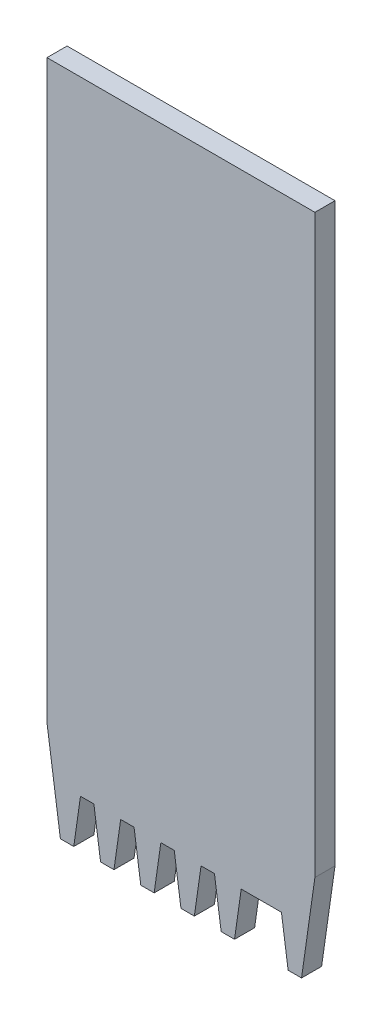
ISO-10303-21;
HEADER;
FILE_DESCRIPTION(('STEP AP214'),'2;1');
FILE_NAME('part.step','',(''),(''),'','','');
FILE_SCHEMA(('AUTOMOTIVE_DESIGN { 1 0 10303 214 1 1 1 1 }'));
ENDSEC;
DATA;
#1=APPLICATION_CONTEXT('core data for automotive mechanical design processes');
#2=APPLICATION_PROTOCOL_DEFINITION('international standard','automotive_design',2000,#1);
#3=PRODUCT_CONTEXT('',#1,'mechanical');
#4=PRODUCT('Part','Part','',(#3));
#5=PRODUCT_RELATED_PRODUCT_CATEGORY('part','',(#4));
#6=PRODUCT_DEFINITION_FORMATION('','',#4);
#7=PRODUCT_DEFINITION_CONTEXT('part definition',#1,'design');
#8=PRODUCT_DEFINITION('design','',#6,#7);
#9=PRODUCT_DEFINITION_SHAPE('','',#8);
#10=(LENGTH_UNIT() NAMED_UNIT(*) SI_UNIT(.MILLI.,.METRE.));
#11=(NAMED_UNIT(*) PLANE_ANGLE_UNIT() SI_UNIT($,.RADIAN.));
#12=(NAMED_UNIT(*) SI_UNIT($,.STERADIAN.) SOLID_ANGLE_UNIT());
#13=UNCERTAINTY_MEASURE_WITH_UNIT(LENGTH_MEASURE(1.E-05),#10,'distance_accuracy_value','');
#14=(GEOMETRIC_REPRESENTATION_CONTEXT(3) GLOBAL_UNCERTAINTY_ASSIGNED_CONTEXT((#13)) GLOBAL_UNIT_ASSIGNED_CONTEXT((#10,
#11,#12)) REPRESENTATION_CONTEXT('',''));
#15=CARTESIAN_POINT('',(0.,0.,0.));
#16=DIRECTION('',(0.,0.,1.));
#17=DIRECTION('',(1.,0.,0.));
#18=AXIS2_PLACEMENT_3D('',#15,#16,#17);
#19=CARTESIAN_POINT('',(0.,50.,1.5));
#20=DIRECTION('',(0.,-1.,0.));
#21=DIRECTION('',(0.,0.,-1.));
#22=AXIS2_PLACEMENT_3D('',#19,#20,#21);
#23=PLANE('',#22);
#24=DIRECTION('',(-1.,0.,0.));
#25=VECTOR('',#24,1.);
#26=CARTESIAN_POINT('',(0.,50.,0.));
#27=LINE('',#26,#25);
#28=CARTESIAN_POINT('',(20.,50.,0.));
#29=VERTEX_POINT('',#28);
#30=CARTESIAN_POINT('',(0.,50.,0.));
#31=VERTEX_POINT('',#30);
#32=EDGE_CURVE('E239',#29,#31,#27,.T.);
#33=ORIENTED_EDGE('',*,*,#32,.T.);
#34=DIRECTION('',(0.,0.,-1.));
#35=VECTOR('',#34,1.);
#36=CARTESIAN_POINT('',(0.,50.,1.5));
#37=LINE('',#36,#35);
#38=CARTESIAN_POINT('',(0.,50.,1.5));
#39=VERTEX_POINT('',#38);
#40=EDGE_CURVE('E11',#39,#31,#37,.T.);
#41=ORIENTED_EDGE('',*,*,#40,.F.);
#42=DIRECTION('',(-1.,0.,0.));
#43=VECTOR('',#42,1.);
#44=CARTESIAN_POINT('',(0.,50.,1.5));
#45=LINE('',#44,#43);
#46=CARTESIAN_POINT('',(20.,50.,1.5));
#47=VERTEX_POINT('',#46);
#48=EDGE_CURVE('E289',#47,#39,#45,.T.);
#49=ORIENTED_EDGE('',*,*,#48,.F.);
#50=DIRECTION('',(0.,0.,-1.));
#51=VECTOR('',#50,1.);
#52=CARTESIAN_POINT('',(20.,50.,1.5));
#53=LINE('',#52,#51);
#54=EDGE_CURVE('E235',#47,#29,#53,.T.);
#55=ORIENTED_EDGE('',*,*,#54,.T.);
#56=EDGE_LOOP('',(#33,#41,#49,#55));
#57=FACE_BOUND('',#56,.T.);
#58=ADVANCED_FACE('F35',(#57),#23,.F.);
#59=CARTESIAN_POINT('',(0.,7.,1.5));
#60=DIRECTION('',(1.,0.,0.));
#61=DIRECTION('',(0.,0.,-1.));
#62=AXIS2_PLACEMENT_3D('',#59,#60,#61);
#63=PLANE('',#62);
#64=DIRECTION('',(0.,-1.,0.));
#65=VECTOR('',#64,1.);
#66=CARTESIAN_POINT('',(0.,7.,0.));
#67=LINE('',#66,#65);
#68=CARTESIAN_POINT('',(0.,7.,0.));
#69=VERTEX_POINT('',#68);
#70=EDGE_CURVE('E242',#31,#69,#67,.T.);
#71=ORIENTED_EDGE('',*,*,#70,.T.);
#72=DIRECTION('',(0.,0.,-1.));
#73=VECTOR('',#72,1.);
#74=CARTESIAN_POINT('',(0.,7.,1.5));
#75=LINE('',#74,#73);
#76=CARTESIAN_POINT('',(0.,7.,1.5));
#77=VERTEX_POINT('',#76);
#78=EDGE_CURVE('E43',#77,#69,#75,.T.);
#79=ORIENTED_EDGE('',*,*,#78,.F.);
#80=DIRECTION('',(0.,-1.,0.));
#81=VECTOR('',#80,1.);
#82=CARTESIAN_POINT('',(0.,7.,1.5));
#83=LINE('',#82,#81);
#84=EDGE_CURVE('E148',#39,#77,#83,.T.);
#85=ORIENTED_EDGE('',*,*,#84,.F.);
#86=ORIENTED_EDGE('',*,*,#40,.T.);
#87=EDGE_LOOP('',(#71,#79,#85,#86));
#88=FACE_BOUND('',#87,.T.);
#89=ADVANCED_FACE('F437',(#88),#63,.F.);
#90=CARTESIAN_POINT('',(0.,7.,1.5));
#91=DIRECTION('',(0.989949493661167,0.14142135623731,0.));
#92=DIRECTION('',(-0.14142135623731,0.989949493661167,0.));
#93=AXIS2_PLACEMENT_3D('',#90,#91,#92);
#94=PLANE('',#93);
#95=DIRECTION('',(0.14142135623731,-0.989949493661167,0.));
#96=VECTOR('',#95,1.);
#97=CARTESIAN_POINT('',(0.,7.,0.));
#98=LINE('',#97,#96);
#99=CARTESIAN_POINT('',(1.,0.,0.));
#100=VERTEX_POINT('',#99);
#101=EDGE_CURVE('E244',#69,#100,#98,.T.);
#102=ORIENTED_EDGE('',*,*,#101,.T.);
#103=DIRECTION('',(0.,0.,-1.));
#104=VECTOR('',#103,1.);
#105=CARTESIAN_POINT('',(1.,0.,1.5));
#106=LINE('',#105,#104);
#107=CARTESIAN_POINT('',(1.,0.,1.5));
#108=VERTEX_POINT('',#107);
#109=EDGE_CURVE('E350',#108,#100,#106,.T.);
#110=ORIENTED_EDGE('',*,*,#109,.F.);
#111=DIRECTION('',(0.14142135623731,-0.989949493661167,0.));
#112=VECTOR('',#111,1.);
#113=CARTESIAN_POINT('',(0.,7.,1.5));
#114=LINE('',#113,#112);
#115=EDGE_CURVE('E358',#77,#108,#114,.T.);
#116=ORIENTED_EDGE('',*,*,#115,.F.);
#117=ORIENTED_EDGE('',*,*,#78,.T.);
#118=EDGE_LOOP('',(#102,#110,#116,#117));
#119=FACE_BOUND('',#118,.T.);
#120=ADVANCED_FACE('F356',(#119),#94,.F.);
#121=CARTESIAN_POINT('',(1.,0.,1.5));
#122=DIRECTION('',(0.,1.,0.));
#123=DIRECTION('',(-1.,0.,0.));
#124=AXIS2_PLACEMENT_3D('',#121,#122,#123);
#125=PLANE('',#124);
#126=DIRECTION('',(1.,0.,0.));
#127=VECTOR('',#126,1.);
#128=CARTESIAN_POINT('',(1.,0.,0.));
#129=LINE('',#128,#127);
#130=CARTESIAN_POINT('',(2.,0.,0.));
#131=VERTEX_POINT('',#130);
#132=EDGE_CURVE('E246',#100,#131,#129,.T.);
#133=ORIENTED_EDGE('',*,*,#132,.T.);
#134=DIRECTION('',(0.,0.,-1.));
#135=VECTOR('',#134,1.);
#136=CARTESIAN_POINT('',(2.,0.,1.5));
#137=LINE('',#136,#135);
#138=CARTESIAN_POINT('',(2.,0.,1.5));
#139=VERTEX_POINT('',#138);
#140=EDGE_CURVE('E347',#139,#131,#137,.T.);
#141=ORIENTED_EDGE('',*,*,#140,.F.);
#142=DIRECTION('',(1.,0.,0.));
#143=VECTOR('',#142,1.);
#144=CARTESIAN_POINT('',(1.,0.,1.5));
#145=LINE('',#144,#143);
#146=EDGE_CURVE('E376',#108,#139,#145,.T.);
#147=ORIENTED_EDGE('',*,*,#146,.F.);
#148=ORIENTED_EDGE('',*,*,#109,.T.);
#149=EDGE_LOOP('',(#133,#141,#147,#148));
#150=FACE_BOUND('',#149,.T.);
#151=ADVANCED_FACE('F367',(#150),#125,.F.);
#152=CARTESIAN_POINT('',(2.,0.,1.5));
#153=DIRECTION('',(-0.989949493661166,0.14142135623731,0.));
#154=DIRECTION('',(-0.14142135623731,-0.989949493661167,0.));
#155=AXIS2_PLACEMENT_3D('',#152,#153,#154);
#156=PLANE('',#155);
#157=DIRECTION('',(0.14142135623731,0.989949493661167,0.));
#158=VECTOR('',#157,1.);
#159=CARTESIAN_POINT('',(2.,0.,0.));
#160=LINE('',#159,#158);
#161=CARTESIAN_POINT('',(2.5,3.5,0.));
#162=VERTEX_POINT('',#161);
#163=EDGE_CURVE('E248',#131,#162,#160,.T.);
#164=ORIENTED_EDGE('',*,*,#163,.T.);
#165=DIRECTION('',(0.,0.,-1.));
#166=VECTOR('',#165,1.);
#167=CARTESIAN_POINT('',(2.5,3.5,1.5));
#168=LINE('',#167,#166);
#169=CARTESIAN_POINT('',(2.5,3.5,1.5));
#170=VERTEX_POINT('',#169);
#171=EDGE_CURVE('E344',#170,#162,#168,.T.);
#172=ORIENTED_EDGE('',*,*,#171,.F.);
#173=DIRECTION('',(0.14142135623731,0.989949493661167,0.));
#174=VECTOR('',#173,1.);
#175=CARTESIAN_POINT('',(2.,0.,1.5));
#176=LINE('',#175,#174);
#177=EDGE_CURVE('E373',#139,#170,#176,.T.);
#178=ORIENTED_EDGE('',*,*,#177,.F.);
#179=ORIENTED_EDGE('',*,*,#140,.T.);
#180=EDGE_LOOP('',(#164,#172,#178,#179));
#181=FACE_BOUND('',#180,.T.);
#182=ADVANCED_FACE('F371',(#181),#156,.F.);
#183=CARTESIAN_POINT('',(2.5,3.5,1.5));
#184=DIRECTION('',(0.,1.,0.));
#185=DIRECTION('',(0.,0.,1.));
#186=AXIS2_PLACEMENT_3D('',#183,#184,#185);
#187=PLANE('',#186);
#188=DIRECTION('',(1.,0.,0.));
#189=VECTOR('',#188,1.);
#190=CARTESIAN_POINT('',(2.5,3.5,0.));
#191=LINE('',#190,#189);
#192=CARTESIAN_POINT('',(3.5,3.5,0.));
#193=VERTEX_POINT('',#192);
#194=EDGE_CURVE('E250',#162,#193,#191,.T.);
#195=ORIENTED_EDGE('',*,*,#194,.T.);
#196=DIRECTION('',(0.,0.,-1.));
#197=VECTOR('',#196,1.);
#198=CARTESIAN_POINT('',(3.5,3.5,1.5));
#199=LINE('',#198,#197);
#200=CARTESIAN_POINT('',(3.5,3.5,1.5));
#201=VERTEX_POINT('',#200);
#202=EDGE_CURVE('E341',#201,#193,#199,.T.);
#203=ORIENTED_EDGE('',*,*,#202,.F.);
#204=DIRECTION('',(1.,0.,0.));
#205=VECTOR('',#204,1.);
#206=CARTESIAN_POINT('',(2.5,3.5,1.5));
#207=LINE('',#206,#205);
#208=EDGE_CURVE('E375',#170,#201,#207,.T.);
#209=ORIENTED_EDGE('',*,*,#208,.F.);
#210=ORIENTED_EDGE('',*,*,#171,.T.);
#211=EDGE_LOOP('',(#195,#203,#209,#210));
#212=FACE_BOUND('',#211,.T.);
#213=ADVANCED_FACE('F450',(#212),#187,.F.);
#214=CARTESIAN_POINT('',(3.5,3.5,1.5));
#215=DIRECTION('',(0.989949493661167,0.14142135623731,0.));
#216=DIRECTION('',(-0.14142135623731,0.989949493661167,0.));
#217=AXIS2_PLACEMENT_3D('',#214,#215,#216);
#218=PLANE('',#217);
#219=DIRECTION('',(0.14142135623731,-0.989949493661167,0.));
#220=VECTOR('',#219,1.);
#221=CARTESIAN_POINT('',(3.5,3.5,0.));
#222=LINE('',#221,#220);
#223=CARTESIAN_POINT('',(4.,0.,0.));
#224=VERTEX_POINT('',#223);
#225=EDGE_CURVE('E252',#193,#224,#222,.T.);
#226=ORIENTED_EDGE('',*,*,#225,.T.);
#227=DIRECTION('',(0.,0.,-1.));
#228=VECTOR('',#227,1.);
#229=CARTESIAN_POINT('',(4.,0.,1.5));
#230=LINE('',#229,#228);
#231=CARTESIAN_POINT('',(4.,0.,1.5));
#232=VERTEX_POINT('',#231);
#233=EDGE_CURVE('E338',#232,#224,#230,.T.);
#234=ORIENTED_EDGE('',*,*,#233,.F.);
#235=DIRECTION('',(0.14142135623731,-0.989949493661167,0.));
#236=VECTOR('',#235,1.);
#237=CARTESIAN_POINT('',(3.5,3.5,1.5));
#238=LINE('',#237,#236);
#239=EDGE_CURVE('E378',#201,#232,#238,.T.);
#240=ORIENTED_EDGE('',*,*,#239,.F.);
#241=ORIENTED_EDGE('',*,*,#202,.T.);
#242=EDGE_LOOP('',(#226,#234,#240,#241));
#243=FACE_BOUND('',#242,.T.);
#244=ADVANCED_FACE('F453',(#243),#218,.F.);
#245=CARTESIAN_POINT('',(4.,0.,1.5));
#246=DIRECTION('',(0.,1.,0.));
#247=DIRECTION('',(-1.,0.,0.));
#248=AXIS2_PLACEMENT_3D('',#245,#246,#247);
#249=PLANE('',#248);
#250=DIRECTION('',(1.,0.,0.));
#251=VECTOR('',#250,1.);
#252=CARTESIAN_POINT('',(4.,0.,0.));
#253=LINE('',#252,#251);
#254=CARTESIAN_POINT('',(5.,0.,0.));
#255=VERTEX_POINT('',#254);
#256=EDGE_CURVE('E254',#224,#255,#253,.T.);
#257=ORIENTED_EDGE('',*,*,#256,.T.);
#258=DIRECTION('',(0.,0.,-1.));
#259=VECTOR('',#258,1.);
#260=CARTESIAN_POINT('',(5.,0.,1.5));
#261=LINE('',#260,#259);
#262=CARTESIAN_POINT('',(5.,0.,1.5));
#263=VERTEX_POINT('',#262);
#264=EDGE_CURVE('E335',#263,#255,#261,.T.);
#265=ORIENTED_EDGE('',*,*,#264,.F.);
#266=DIRECTION('',(1.,0.,0.));
#267=VECTOR('',#266,1.);
#268=CARTESIAN_POINT('',(4.,0.,1.5));
#269=LINE('',#268,#267);
#270=EDGE_CURVE('E384',#232,#263,#269,.T.);
#271=ORIENTED_EDGE('',*,*,#270,.F.);
#272=ORIENTED_EDGE('',*,*,#233,.T.);
#273=EDGE_LOOP('',(#257,#265,#271,#272));
#274=FACE_BOUND('',#273,.T.);
#275=ADVANCED_FACE('F457',(#274),#249,.F.);
#276=CARTESIAN_POINT('',(5.,0.,1.5));
#277=DIRECTION('',(-0.989949493661167,0.14142135623731,0.));
#278=DIRECTION('',(-0.14142135623731,-0.989949493661167,0.));
#279=AXIS2_PLACEMENT_3D('',#276,#277,#278);
#280=PLANE('',#279);
#281=DIRECTION('',(0.14142135623731,0.989949493661166,0.));
#282=VECTOR('',#281,1.);
#283=CARTESIAN_POINT('',(5.,0.,0.));
#284=LINE('',#283,#282);
#285=CARTESIAN_POINT('',(5.5,3.5,0.));
#286=VERTEX_POINT('',#285);
#287=EDGE_CURVE('E256',#255,#286,#284,.T.);
#288=ORIENTED_EDGE('',*,*,#287,.T.);
#289=DIRECTION('',(0.,0.,-1.));
#290=VECTOR('',#289,1.);
#291=CARTESIAN_POINT('',(5.5,3.5,1.5));
#292=LINE('',#291,#290);
#293=CARTESIAN_POINT('',(5.5,3.5,1.5));
#294=VERTEX_POINT('',#293);
#295=EDGE_CURVE('E332',#294,#286,#292,.T.);
#296=ORIENTED_EDGE('',*,*,#295,.F.);
#297=DIRECTION('',(0.14142135623731,0.989949493661166,0.));
#298=VECTOR('',#297,1.);
#299=CARTESIAN_POINT('',(5.,0.,1.5));
#300=LINE('',#299,#298);
#301=EDGE_CURVE('E386',#263,#294,#300,.T.);
#302=ORIENTED_EDGE('',*,*,#301,.F.);
#303=ORIENTED_EDGE('',*,*,#264,.T.);
#304=EDGE_LOOP('',(#288,#296,#302,#303));
#305=FACE_BOUND('',#304,.T.);
#306=ADVANCED_FACE('F461',(#305),#280,.F.);
#307=CARTESIAN_POINT('',(5.5,3.5,1.5));
#308=DIRECTION('',(0.,1.,0.));
#309=DIRECTION('',(0.,0.,1.));
#310=AXIS2_PLACEMENT_3D('',#307,#308,#309);
#311=PLANE('',#310);
#312=DIRECTION('',(1.,0.,0.));
#313=VECTOR('',#312,1.);
#314=CARTESIAN_POINT('',(5.5,3.5,0.));
#315=LINE('',#314,#313);
#316=CARTESIAN_POINT('',(6.5,3.5,0.));
#317=VERTEX_POINT('',#316);
#318=EDGE_CURVE('E258',#286,#317,#315,.T.);
#319=ORIENTED_EDGE('',*,*,#318,.T.);
#320=DIRECTION('',(0.,0.,-1.));
#321=VECTOR('',#320,1.);
#322=CARTESIAN_POINT('',(6.5,3.5,1.5));
#323=LINE('',#322,#321);
#324=CARTESIAN_POINT('',(6.5,3.5,1.5));
#325=VERTEX_POINT('',#324);
#326=EDGE_CURVE('E329',#325,#317,#323,.T.);
#327=ORIENTED_EDGE('',*,*,#326,.F.);
#328=DIRECTION('',(1.,0.,0.));
#329=VECTOR('',#328,1.);
#330=CARTESIAN_POINT('',(5.5,3.5,1.5));
#331=LINE('',#330,#329);
#332=EDGE_CURVE('E388',#294,#325,#331,.T.);
#333=ORIENTED_EDGE('',*,*,#332,.F.);
#334=ORIENTED_EDGE('',*,*,#295,.T.);
#335=EDGE_LOOP('',(#319,#327,#333,#334));
#336=FACE_BOUND('',#335,.T.);
#337=ADVANCED_FACE('F465',(#336),#311,.F.);
#338=CARTESIAN_POINT('',(6.5,3.5,1.5));
#339=DIRECTION('',(0.989949493661167,0.14142135623731,0.));
#340=DIRECTION('',(-0.14142135623731,0.989949493661167,0.));
#341=AXIS2_PLACEMENT_3D('',#338,#339,#340);
#342=PLANE('',#341);
#343=DIRECTION('',(0.14142135623731,-0.989949493661166,0.));
#344=VECTOR('',#343,1.);
#345=CARTESIAN_POINT('',(6.5,3.5,0.));
#346=LINE('',#345,#344);
#347=CARTESIAN_POINT('',(7.,0.,0.));
#348=VERTEX_POINT('',#347);
#349=EDGE_CURVE('E260',#317,#348,#346,.T.);
#350=ORIENTED_EDGE('',*,*,#349,.T.);
#351=DIRECTION('',(0.,0.,-1.));
#352=VECTOR('',#351,1.);
#353=CARTESIAN_POINT('',(7.,0.,1.5));
#354=LINE('',#353,#352);
#355=CARTESIAN_POINT('',(7.,0.,1.5));
#356=VERTEX_POINT('',#355);
#357=EDGE_CURVE('E326',#356,#348,#354,.T.);
#358=ORIENTED_EDGE('',*,*,#357,.F.);
#359=DIRECTION('',(0.14142135623731,-0.989949493661166,0.));
#360=VECTOR('',#359,1.);
#361=CARTESIAN_POINT('',(6.5,3.5,1.5));
#362=LINE('',#361,#360);
#363=EDGE_CURVE('E390',#325,#356,#362,.T.);
#364=ORIENTED_EDGE('',*,*,#363,.F.);
#365=ORIENTED_EDGE('',*,*,#326,.T.);
#366=EDGE_LOOP('',(#350,#358,#364,#365));
#367=FACE_BOUND('',#366,.T.);
#368=ADVANCED_FACE('F469',(#367),#342,.F.);
#369=CARTESIAN_POINT('',(7.,0.,1.5));
#370=DIRECTION('',(0.,1.,0.));
#371=DIRECTION('',(-1.,0.,0.));
#372=AXIS2_PLACEMENT_3D('',#369,#370,#371);
#373=PLANE('',#372);
#374=DIRECTION('',(1.,0.,0.));
#375=VECTOR('',#374,1.);
#376=CARTESIAN_POINT('',(7.,0.,0.));
#377=LINE('',#376,#375);
#378=CARTESIAN_POINT('',(8.,0.,0.));
#379=VERTEX_POINT('',#378);
#380=EDGE_CURVE('E262',#348,#379,#377,.T.);
#381=ORIENTED_EDGE('',*,*,#380,.T.);
#382=DIRECTION('',(0.,0.,-1.));
#383=VECTOR('',#382,1.);
#384=CARTESIAN_POINT('',(8.,0.,1.5));
#385=LINE('',#384,#383);
#386=CARTESIAN_POINT('',(8.,0.,1.5));
#387=VERTEX_POINT('',#386);
#388=EDGE_CURVE('E323',#387,#379,#385,.T.);
#389=ORIENTED_EDGE('',*,*,#388,.F.);
#390=DIRECTION('',(1.,0.,0.));
#391=VECTOR('',#390,1.);
#392=CARTESIAN_POINT('',(7.,0.,1.5));
#393=LINE('',#392,#391);
#394=EDGE_CURVE('E392',#356,#387,#393,.T.);
#395=ORIENTED_EDGE('',*,*,#394,.F.);
#396=ORIENTED_EDGE('',*,*,#357,.T.);
#397=EDGE_LOOP('',(#381,#389,#395,#396));
#398=FACE_BOUND('',#397,.T.);
#399=ADVANCED_FACE('F473',(#398),#373,.F.);
#400=CARTESIAN_POINT('',(8.,0.,1.5));
#401=DIRECTION('',(-0.989949493661166,0.14142135623731,0.));
#402=DIRECTION('',(-0.14142135623731,-0.989949493661167,0.));
#403=AXIS2_PLACEMENT_3D('',#400,#401,#402);
#404=PLANE('',#403);
#405=DIRECTION('',(0.14142135623731,0.989949493661166,0.));
#406=VECTOR('',#405,1.);
#407=CARTESIAN_POINT('',(8.,0.,0.));
#408=LINE('',#407,#406);
#409=CARTESIAN_POINT('',(8.5,3.5,0.));
#410=VERTEX_POINT('',#409);
#411=EDGE_CURVE('E264',#379,#410,#408,.T.);
#412=ORIENTED_EDGE('',*,*,#411,.T.);
#413=DIRECTION('',(0.,0.,-1.));
#414=VECTOR('',#413,1.);
#415=CARTESIAN_POINT('',(8.5,3.5,1.5));
#416=LINE('',#415,#414);
#417=CARTESIAN_POINT('',(8.5,3.5,1.5));
#418=VERTEX_POINT('',#417);
#419=EDGE_CURVE('E320',#418,#410,#416,.T.);
#420=ORIENTED_EDGE('',*,*,#419,.F.);
#421=DIRECTION('',(0.14142135623731,0.989949493661166,0.));
#422=VECTOR('',#421,1.);
#423=CARTESIAN_POINT('',(8.,0.,1.5));
#424=LINE('',#423,#422);
#425=EDGE_CURVE('E394',#387,#418,#424,.T.);
#426=ORIENTED_EDGE('',*,*,#425,.F.);
#427=ORIENTED_EDGE('',*,*,#388,.T.);
#428=EDGE_LOOP('',(#412,#420,#426,#427));
#429=FACE_BOUND('',#428,.T.);
#430=ADVANCED_FACE('F477',(#429),#404,.F.);
#431=CARTESIAN_POINT('',(8.5,3.5,1.5));
#432=DIRECTION('',(0.,1.,0.));
#433=DIRECTION('',(0.,0.,1.));
#434=AXIS2_PLACEMENT_3D('',#431,#432,#433);
#435=PLANE('',#434);
#436=DIRECTION('',(1.,0.,0.));
#437=VECTOR('',#436,1.);
#438=CARTESIAN_POINT('',(8.5,3.5,0.));
#439=LINE('',#438,#437);
#440=CARTESIAN_POINT('',(9.5,3.5,0.));
#441=VERTEX_POINT('',#440);
#442=EDGE_CURVE('E266',#410,#441,#439,.T.);
#443=ORIENTED_EDGE('',*,*,#442,.T.);
#444=DIRECTION('',(0.,0.,-1.));
#445=VECTOR('',#444,1.);
#446=CARTESIAN_POINT('',(9.5,3.5,1.5));
#447=LINE('',#446,#445);
#448=CARTESIAN_POINT('',(9.5,3.5,1.5));
#449=VERTEX_POINT('',#448);
#450=EDGE_CURVE('E317',#449,#441,#447,.T.);
#451=ORIENTED_EDGE('',*,*,#450,.F.);
#452=DIRECTION('',(1.,0.,0.));
#453=VECTOR('',#452,1.);
#454=CARTESIAN_POINT('',(8.5,3.5,1.5));
#455=LINE('',#454,#453);
#456=EDGE_CURVE('E396',#418,#449,#455,.T.);
#457=ORIENTED_EDGE('',*,*,#456,.F.);
#458=ORIENTED_EDGE('',*,*,#419,.T.);
#459=EDGE_LOOP('',(#443,#451,#457,#458));
#460=FACE_BOUND('',#459,.T.);
#461=ADVANCED_FACE('F481',(#460),#435,.F.);
#462=CARTESIAN_POINT('',(9.5,3.5,1.5));
#463=DIRECTION('',(0.989949493661167,0.14142135623731,0.));
#464=DIRECTION('',(-0.14142135623731,0.989949493661167,0.));
#465=AXIS2_PLACEMENT_3D('',#462,#463,#464);
#466=PLANE('',#465);
#467=DIRECTION('',(0.14142135623731,-0.989949493661166,0.));
#468=VECTOR('',#467,1.);
#469=CARTESIAN_POINT('',(9.5,3.5,0.));
#470=LINE('',#469,#468);
#471=CARTESIAN_POINT('',(10.,0.,0.));
#472=VERTEX_POINT('',#471);
#473=EDGE_CURVE('E268',#441,#472,#470,.T.);
#474=ORIENTED_EDGE('',*,*,#473,.T.);
#475=DIRECTION('',(0.,0.,-1.));
#476=VECTOR('',#475,1.);
#477=CARTESIAN_POINT('',(10.,0.,1.5));
#478=LINE('',#477,#476);
#479=CARTESIAN_POINT('',(10.,0.,1.5));
#480=VERTEX_POINT('',#479);
#481=EDGE_CURVE('E314',#480,#472,#478,.T.);
#482=ORIENTED_EDGE('',*,*,#481,.F.);
#483=DIRECTION('',(0.14142135623731,-0.989949493661166,0.));
#484=VECTOR('',#483,1.);
#485=CARTESIAN_POINT('',(9.5,3.5,1.5));
#486=LINE('',#485,#484);
#487=EDGE_CURVE('E398',#449,#480,#486,.T.);
#488=ORIENTED_EDGE('',*,*,#487,.F.);
#489=ORIENTED_EDGE('',*,*,#450,.T.);
#490=EDGE_LOOP('',(#474,#482,#488,#489));
#491=FACE_BOUND('',#490,.T.);
#492=ADVANCED_FACE('F485',(#491),#466,.F.);
#493=CARTESIAN_POINT('',(10.,0.,1.5));
#494=DIRECTION('',(0.,1.,0.));
#495=DIRECTION('',(-1.,0.,0.));
#496=AXIS2_PLACEMENT_3D('',#493,#494,#495);
#497=PLANE('',#496);
#498=DIRECTION('',(1.,0.,0.));
#499=VECTOR('',#498,1.);
#500=CARTESIAN_POINT('',(10.,0.,0.));
#501=LINE('',#500,#499);
#502=CARTESIAN_POINT('',(11.,0.,0.));
#503=VERTEX_POINT('',#502);
#504=EDGE_CURVE('E270',#472,#503,#501,.T.);
#505=ORIENTED_EDGE('',*,*,#504,.T.);
#506=DIRECTION('',(0.,0.,-1.));
#507=VECTOR('',#506,1.);
#508=CARTESIAN_POINT('',(11.,0.,1.5));
#509=LINE('',#508,#507);
#510=CARTESIAN_POINT('',(11.,0.,1.5));
#511=VERTEX_POINT('',#510);
#512=EDGE_CURVE('E311',#511,#503,#509,.T.);
#513=ORIENTED_EDGE('',*,*,#512,.F.);
#514=DIRECTION('',(1.,0.,0.));
#515=VECTOR('',#514,1.);
#516=CARTESIAN_POINT('',(10.,0.,1.5));
#517=LINE('',#516,#515);
#518=EDGE_CURVE('E400',#480,#511,#517,.T.);
#519=ORIENTED_EDGE('',*,*,#518,.F.);
#520=ORIENTED_EDGE('',*,*,#481,.T.);
#521=EDGE_LOOP('',(#505,#513,#519,#520));
#522=FACE_BOUND('',#521,.T.);
#523=ADVANCED_FACE('F489',(#522),#497,.F.);
#524=CARTESIAN_POINT('',(11.,0.,1.5));
#525=DIRECTION('',(-0.989949493661166,0.14142135623731,0.));
#526=DIRECTION('',(-0.14142135623731,-0.989949493661167,0.));
#527=AXIS2_PLACEMENT_3D('',#524,#525,#526);
#528=PLANE('',#527);
#529=DIRECTION('',(0.14142135623731,0.989949493661166,0.));
#530=VECTOR('',#529,1.);
#531=CARTESIAN_POINT('',(11.,0.,0.));
#532=LINE('',#531,#530);
#533=CARTESIAN_POINT('',(11.5,3.5,0.));
#534=VERTEX_POINT('',#533);
#535=EDGE_CURVE('E272',#503,#534,#532,.T.);
#536=ORIENTED_EDGE('',*,*,#535,.T.);
#537=DIRECTION('',(0.,0.,-1.));
#538=VECTOR('',#537,1.);
#539=CARTESIAN_POINT('',(11.5,3.5,1.5));
#540=LINE('',#539,#538);
#541=CARTESIAN_POINT('',(11.5,3.5,1.5));
#542=VERTEX_POINT('',#541);
#543=EDGE_CURVE('E308',#542,#534,#540,.T.);
#544=ORIENTED_EDGE('',*,*,#543,.F.);
#545=DIRECTION('',(0.14142135623731,0.989949493661166,0.));
#546=VECTOR('',#545,1.);
#547=CARTESIAN_POINT('',(11.,0.,1.5));
#548=LINE('',#547,#546);
#549=EDGE_CURVE('E402',#511,#542,#548,.T.);
#550=ORIENTED_EDGE('',*,*,#549,.F.);
#551=ORIENTED_EDGE('',*,*,#512,.T.);
#552=EDGE_LOOP('',(#536,#544,#550,#551));
#553=FACE_BOUND('',#552,.T.);
#554=ADVANCED_FACE('F493',(#553),#528,.F.);
#555=CARTESIAN_POINT('',(11.5,3.5,1.5));
#556=DIRECTION('',(0.,1.,0.));
#557=DIRECTION('',(0.,0.,1.));
#558=AXIS2_PLACEMENT_3D('',#555,#556,#557);
#559=PLANE('',#558);
#560=DIRECTION('',(1.,0.,0.));
#561=VECTOR('',#560,1.);
#562=CARTESIAN_POINT('',(11.5,3.5,0.));
#563=LINE('',#562,#561);
#564=CARTESIAN_POINT('',(12.5,3.5,0.));
#565=VERTEX_POINT('',#564);
#566=EDGE_CURVE('E274',#534,#565,#563,.T.);
#567=ORIENTED_EDGE('',*,*,#566,.T.);
#568=DIRECTION('',(0.,0.,-1.));
#569=VECTOR('',#568,1.);
#570=CARTESIAN_POINT('',(12.5,3.5,1.5));
#571=LINE('',#570,#569);
#572=CARTESIAN_POINT('',(12.5,3.5,1.5));
#573=VERTEX_POINT('',#572);
#574=EDGE_CURVE('E305',#573,#565,#571,.T.);
#575=ORIENTED_EDGE('',*,*,#574,.F.);
#576=DIRECTION('',(1.,0.,0.));
#577=VECTOR('',#576,1.);
#578=CARTESIAN_POINT('',(11.5,3.5,1.5));
#579=LINE('',#578,#577);
#580=EDGE_CURVE('E404',#542,#573,#579,.T.);
#581=ORIENTED_EDGE('',*,*,#580,.F.);
#582=ORIENTED_EDGE('',*,*,#543,.T.);
#583=EDGE_LOOP('',(#567,#575,#581,#582));
#584=FACE_BOUND('',#583,.T.);
#585=ADVANCED_FACE('F497',(#584),#559,.F.);
#586=CARTESIAN_POINT('',(12.5,3.5,1.5));
#587=DIRECTION('',(0.989949493661166,0.14142135623731,0.));
#588=DIRECTION('',(-0.14142135623731,0.989949493661167,0.));
#589=AXIS2_PLACEMENT_3D('',#586,#587,#588);
#590=PLANE('',#589);
#591=DIRECTION('',(0.14142135623731,-0.989949493661166,0.));
#592=VECTOR('',#591,1.);
#593=CARTESIAN_POINT('',(12.5,3.5,0.));
#594=LINE('',#593,#592);
#595=CARTESIAN_POINT('',(13.,0.,0.));
#596=VERTEX_POINT('',#595);
#597=EDGE_CURVE('E276',#565,#596,#594,.T.);
#598=ORIENTED_EDGE('',*,*,#597,.T.);
#599=DIRECTION('',(0.,0.,-1.));
#600=VECTOR('',#599,1.);
#601=CARTESIAN_POINT('',(13.,0.,1.5));
#602=LINE('',#601,#600);
#603=CARTESIAN_POINT('',(13.,0.,1.5));
#604=VERTEX_POINT('',#603);
#605=EDGE_CURVE('E302',#604,#596,#602,.T.);
#606=ORIENTED_EDGE('',*,*,#605,.F.);
#607=DIRECTION('',(0.14142135623731,-0.989949493661166,0.));
#608=VECTOR('',#607,1.);
#609=CARTESIAN_POINT('',(12.5,3.5,1.5));
#610=LINE('',#609,#608);
#611=EDGE_CURVE('E406',#573,#604,#610,.T.);
#612=ORIENTED_EDGE('',*,*,#611,.F.);
#613=ORIENTED_EDGE('',*,*,#574,.T.);
#614=EDGE_LOOP('',(#598,#606,#612,#613));
#615=FACE_BOUND('',#614,.T.);
#616=ADVANCED_FACE('F501',(#615),#590,.F.);
#617=CARTESIAN_POINT('',(13.,0.,1.5));
#618=DIRECTION('',(0.,1.,0.));
#619=DIRECTION('',(-1.,0.,0.));
#620=AXIS2_PLACEMENT_3D('',#617,#618,#619);
#621=PLANE('',#620);
#622=DIRECTION('',(1.,0.,0.));
#623=VECTOR('',#622,1.);
#624=CARTESIAN_POINT('',(13.,0.,0.));
#625=LINE('',#624,#623);
#626=CARTESIAN_POINT('',(14.,0.,0.));
#627=VERTEX_POINT('',#626);
#628=EDGE_CURVE('E278',#596,#627,#625,.T.);
#629=ORIENTED_EDGE('',*,*,#628,.T.);
#630=DIRECTION('',(0.,0.,-1.));
#631=VECTOR('',#630,1.);
#632=CARTESIAN_POINT('',(14.,0.,1.5));
#633=LINE('',#632,#631);
#634=CARTESIAN_POINT('',(14.,0.,1.5));
#635=VERTEX_POINT('',#634);
#636=EDGE_CURVE('E299',#635,#627,#633,.T.);
#637=ORIENTED_EDGE('',*,*,#636,.F.);
#638=DIRECTION('',(1.,0.,0.));
#639=VECTOR('',#638,1.);
#640=CARTESIAN_POINT('',(13.,0.,1.5));
#641=LINE('',#640,#639);
#642=EDGE_CURVE('E408',#604,#635,#641,.T.);
#643=ORIENTED_EDGE('',*,*,#642,.F.);
#644=ORIENTED_EDGE('',*,*,#605,.T.);
#645=EDGE_LOOP('',(#629,#637,#643,#644));
#646=FACE_BOUND('',#645,.T.);
#647=ADVANCED_FACE('F505',(#646),#621,.F.);
#648=CARTESIAN_POINT('',(14.,0.,1.5));
#649=DIRECTION('',(-0.989949493661167,0.14142135623731,0.));
#650=DIRECTION('',(-0.14142135623731,-0.989949493661167,0.));
#651=AXIS2_PLACEMENT_3D('',#648,#649,#650);
#652=PLANE('',#651);
#653=DIRECTION('',(0.14142135623731,0.989949493661166,0.));
#654=VECTOR('',#653,1.);
#655=CARTESIAN_POINT('',(14.,0.,0.));
#656=LINE('',#655,#654);
#657=CARTESIAN_POINT('',(14.5,3.5,0.));
#658=VERTEX_POINT('',#657);
#659=EDGE_CURVE('E280',#627,#658,#656,.T.);
#660=ORIENTED_EDGE('',*,*,#659,.T.);
#661=DIRECTION('',(0.,0.,-1.));
#662=VECTOR('',#661,1.);
#663=CARTESIAN_POINT('',(14.5,3.5,1.5));
#664=LINE('',#663,#662);
#665=CARTESIAN_POINT('',(14.5,3.5,1.5));
#666=VERTEX_POINT('',#665);
#667=EDGE_CURVE('E296',#666,#658,#664,.T.);
#668=ORIENTED_EDGE('',*,*,#667,.F.);
#669=DIRECTION('',(0.14142135623731,0.989949493661166,0.));
#670=VECTOR('',#669,1.);
#671=CARTESIAN_POINT('',(14.,0.,1.5));
#672=LINE('',#671,#670);
#673=EDGE_CURVE('E410',#635,#666,#672,.T.);
#674=ORIENTED_EDGE('',*,*,#673,.F.);
#675=ORIENTED_EDGE('',*,*,#636,.T.);
#676=EDGE_LOOP('',(#660,#668,#674,#675));
#677=FACE_BOUND('',#676,.T.);
#678=ADVANCED_FACE('F509',(#677),#652,.F.);
#679=CARTESIAN_POINT('',(14.5,3.5,1.5));
#680=DIRECTION('',(0.,1.,0.));
#681=DIRECTION('',(0.,0.,1.));
#682=AXIS2_PLACEMENT_3D('',#679,#680,#681);
#683=PLANE('',#682);
#684=DIRECTION('',(1.,0.,0.));
#685=VECTOR('',#684,1.);
#686=CARTESIAN_POINT('',(14.5,3.5,0.));
#687=LINE('',#686,#685);
#688=CARTESIAN_POINT('',(17.5,3.5,0.));
#689=VERTEX_POINT('',#688);
#690=EDGE_CURVE('E282',#658,#689,#687,.T.);
#691=ORIENTED_EDGE('',*,*,#690,.T.);
#692=DIRECTION('',(0.,0.,-1.));
#693=VECTOR('',#692,1.);
#694=CARTESIAN_POINT('',(17.5,3.5,1.5));
#695=LINE('',#694,#693);
#696=CARTESIAN_POINT('',(17.5,3.5,1.5));
#697=VERTEX_POINT('',#696);
#698=EDGE_CURVE('E293',#697,#689,#695,.T.);
#699=ORIENTED_EDGE('',*,*,#698,.F.);
#700=DIRECTION('',(1.,0.,0.));
#701=VECTOR('',#700,1.);
#702=CARTESIAN_POINT('',(14.5,3.5,1.5));
#703=LINE('',#702,#701);
#704=EDGE_CURVE('E412',#666,#697,#703,.T.);
#705=ORIENTED_EDGE('',*,*,#704,.F.);
#706=ORIENTED_EDGE('',*,*,#667,.T.);
#707=EDGE_LOOP('',(#691,#699,#705,#706));
#708=FACE_BOUND('',#707,.T.);
#709=ADVANCED_FACE('F418',(#708),#683,.F.);
#710=CARTESIAN_POINT('',(17.5,3.5,1.5));
#711=DIRECTION('',(0.989949493661166,0.14142135623731,0.));
#712=DIRECTION('',(-0.141421356237311,0.989949493661167,0.));
#713=AXIS2_PLACEMENT_3D('',#710,#711,#712);
#714=PLANE('',#713);
#715=DIRECTION('',(0.14142135623731,-0.989949493661166,0.));
#716=VECTOR('',#715,1.);
#717=CARTESIAN_POINT('',(17.5,3.5,0.));
#718=LINE('',#717,#716);
#719=CARTESIAN_POINT('',(18.,0.,0.));
#720=VERTEX_POINT('',#719);
#721=EDGE_CURVE('E284',#689,#720,#718,.T.);
#722=ORIENTED_EDGE('',*,*,#721,.T.);
#723=DIRECTION('',(0.,0.,-1.));
#724=VECTOR('',#723,1.);
#725=CARTESIAN_POINT('',(18.,0.,1.5));
#726=LINE('',#725,#724);
#727=CARTESIAN_POINT('',(18.,0.,1.5));
#728=VERTEX_POINT('',#727);
#729=EDGE_CURVE('E230',#728,#720,#726,.T.);
#730=ORIENTED_EDGE('',*,*,#729,.F.);
#731=DIRECTION('',(0.14142135623731,-0.989949493661166,0.));
#732=VECTOR('',#731,1.);
#733=CARTESIAN_POINT('',(17.5,3.5,1.5));
#734=LINE('',#733,#732);
#735=EDGE_CURVE('E221',#697,#728,#734,.T.);
#736=ORIENTED_EDGE('',*,*,#735,.F.);
#737=ORIENTED_EDGE('',*,*,#698,.T.);
#738=EDGE_LOOP('',(#722,#730,#736,#737));
#739=FACE_BOUND('',#738,.T.);
#740=ADVANCED_FACE('F422',(#739),#714,.F.);
#741=CARTESIAN_POINT('',(18.,0.,1.5));
#742=DIRECTION('',(0.,1.,0.));
#743=DIRECTION('',(-1.,0.,0.));
#744=AXIS2_PLACEMENT_3D('',#741,#742,#743);
#745=PLANE('',#744);
#746=DIRECTION('',(1.,0.,0.));
#747=VECTOR('',#746,1.);
#748=CARTESIAN_POINT('',(18.,0.,0.));
#749=LINE('',#748,#747);
#750=CARTESIAN_POINT('',(19.,0.,0.));
#751=VERTEX_POINT('',#750);
#752=EDGE_CURVE('E229',#720,#751,#749,.T.);
#753=ORIENTED_EDGE('',*,*,#752,.T.);
#754=DIRECTION('',(0.,0.,-1.));
#755=VECTOR('',#754,1.);
#756=CARTESIAN_POINT('',(19.,0.,1.5));
#757=LINE('',#756,#755);
#758=CARTESIAN_POINT('',(19.,0.,1.5));
#759=VERTEX_POINT('',#758);
#760=EDGE_CURVE('E226',#759,#751,#757,.T.);
#761=ORIENTED_EDGE('',*,*,#760,.F.);
#762=DIRECTION('',(1.,0.,0.));
#763=VECTOR('',#762,1.);
#764=CARTESIAN_POINT('',(18.,0.,1.5));
#765=LINE('',#764,#763);
#766=EDGE_CURVE('E215',#728,#759,#765,.T.);
#767=ORIENTED_EDGE('',*,*,#766,.F.);
#768=ORIENTED_EDGE('',*,*,#729,.T.);
#769=EDGE_LOOP('',(#753,#761,#767,#768));
#770=FACE_BOUND('',#769,.T.);
#771=ADVANCED_FACE('F227',(#770),#745,.F.);
#772=CARTESIAN_POINT('',(19.,0.,1.5));
#773=DIRECTION('',(-0.989949493661166,0.14142135623731,0.));
#774=DIRECTION('',(-0.14142135623731,-0.989949493661167,0.));
#775=AXIS2_PLACEMENT_3D('',#772,#773,#774);
#776=PLANE('',#775);
#777=DIRECTION('',(0.14142135623731,0.989949493661166,0.));
#778=VECTOR('',#777,1.);
#779=CARTESIAN_POINT('',(19.,0.,0.));
#780=LINE('',#779,#778);
#781=CARTESIAN_POINT('',(20.,6.99999999999996,0.));
#782=VERTEX_POINT('',#781);
#783=EDGE_CURVE('E134',#751,#782,#780,.T.);
#784=ORIENTED_EDGE('',*,*,#783,.T.);
#785=DIRECTION('',(0.,0.,-1.));
#786=VECTOR('',#785,1.);
#787=CARTESIAN_POINT('',(20.,6.99999999999996,1.5));
#788=LINE('',#787,#786);
#789=CARTESIAN_POINT('',(20.,6.99999999999996,1.5));
#790=VERTEX_POINT('',#789);
#791=EDGE_CURVE('E231',#790,#782,#788,.T.);
#792=ORIENTED_EDGE('',*,*,#791,.F.);
#793=DIRECTION('',(0.14142135623731,0.989949493661166,0.));
#794=VECTOR('',#793,1.);
#795=CARTESIAN_POINT('',(19.,0.,1.5));
#796=LINE('',#795,#794);
#797=EDGE_CURVE('E219',#759,#790,#796,.T.);
#798=ORIENTED_EDGE('',*,*,#797,.F.);
#799=ORIENTED_EDGE('',*,*,#760,.T.);
#800=EDGE_LOOP('',(#784,#792,#798,#799));
#801=FACE_BOUND('',#800,.T.);
#802=ADVANCED_FACE('F233',(#801),#776,.F.);
#803=CARTESIAN_POINT('',(20.,50.,1.5));
#804=DIRECTION('',(-1.,0.,0.));
#805=DIRECTION('',(0.,-1.,0.));
#806=AXIS2_PLACEMENT_3D('',#803,#804,#805);
#807=PLANE('',#806);
#808=DIRECTION('',(0.,1.,0.));
#809=VECTOR('',#808,1.);
#810=CARTESIAN_POINT('',(20.,50.,0.));
#811=LINE('',#810,#809);
#812=EDGE_CURVE('E140',#782,#29,#811,.T.);
#813=ORIENTED_EDGE('',*,*,#812,.T.);
#814=ORIENTED_EDGE('',*,*,#54,.F.);
#815=DIRECTION('',(0.,1.,0.));
#816=VECTOR('',#815,1.);
#817=CARTESIAN_POINT('',(20.,50.,1.5));
#818=LINE('',#817,#816);
#819=EDGE_CURVE('E51',#790,#47,#818,.T.);
#820=ORIENTED_EDGE('',*,*,#819,.F.);
#821=ORIENTED_EDGE('',*,*,#791,.T.);
#822=EDGE_LOOP('',(#813,#814,#820,#821));
#823=FACE_BOUND('',#822,.T.);
#824=ADVANCED_FACE('F426',(#823),#807,.F.);
#825=CARTESIAN_POINT('',(0.,0.,1.5));
#826=DIRECTION('',(0.,0.,-1.));
#827=DIRECTION('',(-1.,0.,0.));
#828=AXIS2_PLACEMENT_3D('',#825,#826,#827);
#829=PLANE('',#828);
#830=ORIENTED_EDGE('',*,*,#48,.T.);
#831=ORIENTED_EDGE('',*,*,#84,.T.);
#832=ORIENTED_EDGE('',*,*,#115,.T.);
#833=ORIENTED_EDGE('',*,*,#146,.T.);
#834=ORIENTED_EDGE('',*,*,#177,.T.);
#835=ORIENTED_EDGE('',*,*,#208,.T.);
#836=ORIENTED_EDGE('',*,*,#239,.T.);
#837=ORIENTED_EDGE('',*,*,#270,.T.);
#838=ORIENTED_EDGE('',*,*,#301,.T.);
#839=ORIENTED_EDGE('',*,*,#332,.T.);
#840=ORIENTED_EDGE('',*,*,#363,.T.);
#841=ORIENTED_EDGE('',*,*,#394,.T.);
#842=ORIENTED_EDGE('',*,*,#425,.T.);
#843=ORIENTED_EDGE('',*,*,#456,.T.);
#844=ORIENTED_EDGE('',*,*,#487,.T.);
#845=ORIENTED_EDGE('',*,*,#518,.T.);
#846=ORIENTED_EDGE('',*,*,#549,.T.);
#847=ORIENTED_EDGE('',*,*,#580,.T.);
#848=ORIENTED_EDGE('',*,*,#611,.T.);
#849=ORIENTED_EDGE('',*,*,#642,.T.);
#850=ORIENTED_EDGE('',*,*,#673,.T.);
#851=ORIENTED_EDGE('',*,*,#704,.T.);
#852=ORIENTED_EDGE('',*,*,#735,.T.);
#853=ORIENTED_EDGE('',*,*,#766,.T.);
#854=ORIENTED_EDGE('',*,*,#797,.T.);
#855=ORIENTED_EDGE('',*,*,#819,.T.);
#856=EDGE_LOOP('',(#830,#831,#832,#833,#834,#835,#836,#837,#838,#839,#840,#841,#842,#843,#844,
#845,#846,#847,#848,#849,#850,#851,#852,#853,#854,#855));
#857=FACE_BOUND('',#856,.T.);
#858=ADVANCED_FACE('F217',(#857),#829,.F.);
#859=CARTESIAN_POINT('',(0.,0.,0.));
#860=DIRECTION('',(0.,0.,-1.));
#861=DIRECTION('',(-1.,0.,0.));
#862=AXIS2_PLACEMENT_3D('',#859,#860,#861);
#863=PLANE('',#862);
#864=ORIENTED_EDGE('',*,*,#32,.F.);
#865=ORIENTED_EDGE('',*,*,#812,.F.);
#866=ORIENTED_EDGE('',*,*,#783,.F.);
#867=ORIENTED_EDGE('',*,*,#752,.F.);
#868=ORIENTED_EDGE('',*,*,#721,.F.);
#869=ORIENTED_EDGE('',*,*,#690,.F.);
#870=ORIENTED_EDGE('',*,*,#659,.F.);
#871=ORIENTED_EDGE('',*,*,#628,.F.);
#872=ORIENTED_EDGE('',*,*,#597,.F.);
#873=ORIENTED_EDGE('',*,*,#566,.F.);
#874=ORIENTED_EDGE('',*,*,#535,.F.);
#875=ORIENTED_EDGE('',*,*,#504,.F.);
#876=ORIENTED_EDGE('',*,*,#473,.F.);
#877=ORIENTED_EDGE('',*,*,#442,.F.);
#878=ORIENTED_EDGE('',*,*,#411,.F.);
#879=ORIENTED_EDGE('',*,*,#380,.F.);
#880=ORIENTED_EDGE('',*,*,#349,.F.);
#881=ORIENTED_EDGE('',*,*,#318,.F.);
#882=ORIENTED_EDGE('',*,*,#287,.F.);
#883=ORIENTED_EDGE('',*,*,#256,.F.);
#884=ORIENTED_EDGE('',*,*,#225,.F.);
#885=ORIENTED_EDGE('',*,*,#194,.F.);
#886=ORIENTED_EDGE('',*,*,#163,.F.);
#887=ORIENTED_EDGE('',*,*,#132,.F.);
#888=ORIENTED_EDGE('',*,*,#101,.F.);
#889=ORIENTED_EDGE('',*,*,#70,.F.);
#890=EDGE_LOOP('',(#864,#865,#866,#867,#868,#869,#870,#871,#872,#873,#874,#875,#876,#877,#878,
#879,#880,#881,#882,#883,#884,#885,#886,#887,#888,#889));
#891=FACE_BOUND('',#890,.T.);
#892=ADVANCED_FACE('F362',(#891),#863,.T.);
#893=CLOSED_SHELL('',(#58,#89,#120,#151,#182,#213,#244,#275,#306,#337,#368,#399,#430,#461,#492,
#523,#554,#585,#616,#647,#678,#709,#740,#771,#802,#824,#858,#892));
#894=MANIFOLD_SOLID_BREP('B2',#893);
#895=ADVANCED_BREP_SHAPE_REPRESENTATION('',(#18,#894),#14);
#896=SHAPE_DEFINITION_REPRESENTATION(#9,#895);
ENDSEC;
END-ISO-10303-21;
